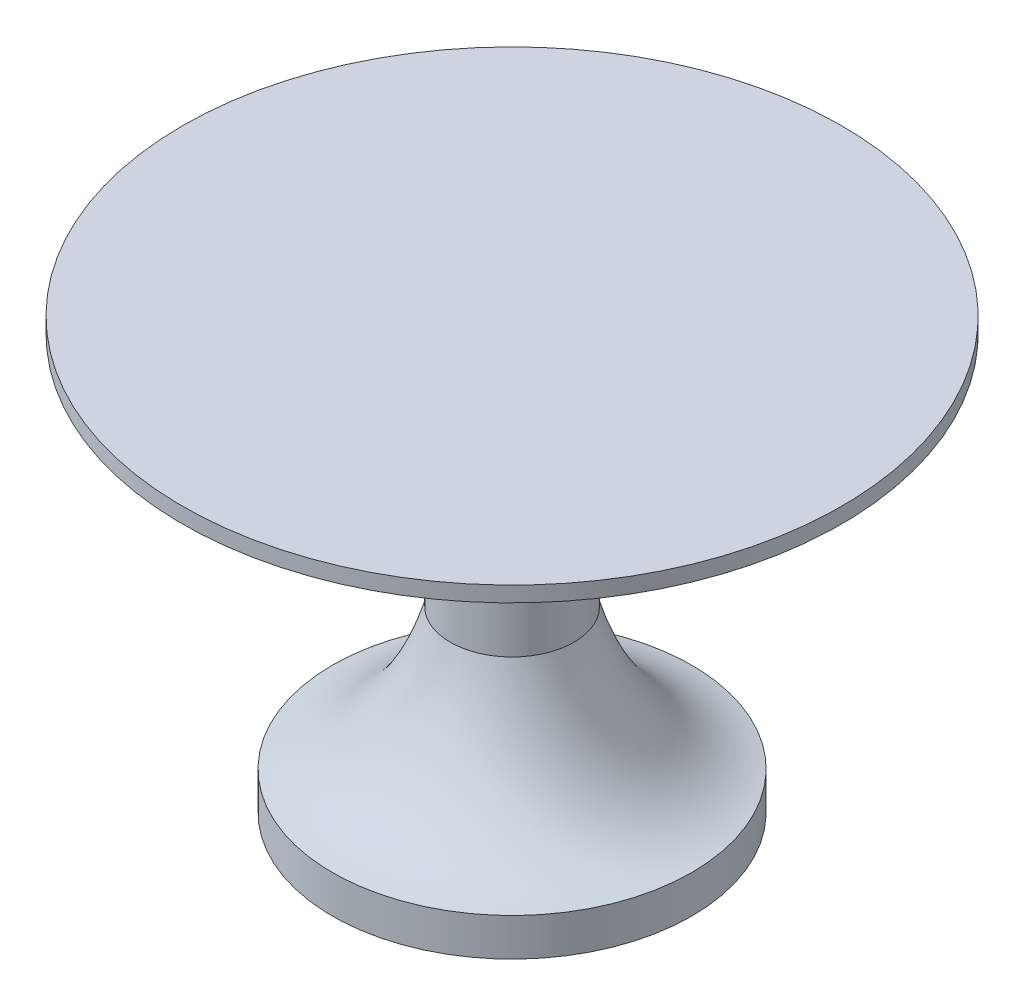
ISO-10303-21;
HEADER;
FILE_DESCRIPTION(('STEP AP214'),'2;1');
FILE_NAME('part.step','',(''),(''),'','','');
FILE_SCHEMA(('AUTOMOTIVE_DESIGN { 1 0 10303 214 1 1 1 1 }'));
ENDSEC;
DATA;
#1=APPLICATION_CONTEXT('core data for automotive mechanical design processes');
#2=APPLICATION_PROTOCOL_DEFINITION('international standard','automotive_design',2000,#1);
#3=PRODUCT_CONTEXT('',#1,'mechanical');
#4=PRODUCT('Part','Part','',(#3));
#5=PRODUCT_RELATED_PRODUCT_CATEGORY('part','',(#4));
#6=PRODUCT_DEFINITION_FORMATION('','',#4);
#7=PRODUCT_DEFINITION_CONTEXT('part definition',#1,'design');
#8=PRODUCT_DEFINITION('design','',#6,#7);
#9=PRODUCT_DEFINITION_SHAPE('','',#8);
#10=(LENGTH_UNIT() NAMED_UNIT(*) SI_UNIT(.MILLI.,.METRE.));
#11=(NAMED_UNIT(*) PLANE_ANGLE_UNIT() SI_UNIT($,.RADIAN.));
#12=(NAMED_UNIT(*) SI_UNIT($,.STERADIAN.) SOLID_ANGLE_UNIT());
#13=UNCERTAINTY_MEASURE_WITH_UNIT(LENGTH_MEASURE(1.E-05),#10,'distance_accuracy_value','');
#14=(GEOMETRIC_REPRESENTATION_CONTEXT(3) GLOBAL_UNCERTAINTY_ASSIGNED_CONTEXT((#13)) GLOBAL_UNIT_ASSIGNED_CONTEXT((#10,
#11,#12)) REPRESENTATION_CONTEXT('',''));
#15=CARTESIAN_POINT('',(0.,0.,0.));
#16=DIRECTION('',(0.,0.,1.));
#17=DIRECTION('',(1.,0.,0.));
#18=AXIS2_PLACEMENT_3D('',#15,#16,#17);
#19=CARTESIAN_POINT('',(0.,-508.,0.));
#20=DIRECTION('',(0.,1.,0.));
#21=DIRECTION('',(-1.,0.,0.));
#22=AXIS2_PLACEMENT_3D('',#19,#20,#21);
#23=PLANE('',#22);
#24=CARTESIAN_POINT('',(0.,-508.,0.));
#25=DIRECTION('',(0.,1.,0.));
#26=DIRECTION('',(-1.,0.,0.));
#27=AXIS2_PLACEMENT_3D('',#24,#25,#26);
#28=CIRCLE('',#27,57.1952071885499);
#29=CARTESIAN_POINT('',(-57.1952071885498,-508.,0.));
#30=VERTEX_POINT('',#29);
#31=EDGE_CURVE('E10',#30,#30,#28,.T.);
#32=ORIENTED_EDGE('',*,*,#31,.F.);
#33=EDGE_LOOP('',(#32));
#34=FACE_BOUND('',#33,.T.);
#35=ADVANCED_FACE('F33',(#34),#23,.F.);
#36=CARTESIAN_POINT('',(332.316500716047,-766.703289197428,0.));
#37=CARTESIAN_POINT('',(180.787832632175,-766.227742438908,0.));
#38=CARTESIAN_POINT('',(148.104498186163,-589.357090778768,0.));
#39=CARTESIAN_POINT('',(57.1952071885499,-508.,0.));
#40=B_SPLINE_CURVE_WITH_KNOTS('',3,(#36,#37,#38,#39),.UNSPECIFIED.,.F.,.F.,(4,4),(0.,1.),.UNSPECIFIED.);
#41=CARTESIAN_POINT('',(0.,0.,0.));
#42=DIRECTION('',(0.,1.,0.));
#43=AXIS1_PLACEMENT('',#41,#42);
#44=SURFACE_OF_REVOLUTION('',#40,#43);
#45=ORIENTED_EDGE('',*,*,#31,.T.);
#46=EDGE_LOOP('',(#45));
#47=FACE_BOUND('',#46,.T.);
#48=CARTESIAN_POINT('',(0.,-766.703289197428,0.));
#49=DIRECTION('',(0.,1.,0.));
#50=DIRECTION('',(-1.,0.,0.));
#51=AXIS2_PLACEMENT_3D('',#48,#49,#50);
#52=CIRCLE('',#51,332.316500716047);
#53=CARTESIAN_POINT('',(-332.316500716047,-766.703289197428,0.));
#54=VERTEX_POINT('',#53);
#55=EDGE_CURVE('E39',#54,#54,#52,.T.);
#56=ORIENTED_EDGE('',*,*,#55,.F.);
#57=EDGE_LOOP('',(#56));
#58=FACE_BOUND('',#57,.T.);
#59=ADVANCED_FACE('F81',(#47,#58),#44,.F.);
#60=CARTESIAN_POINT('',(0.,0.,0.));
#61=DIRECTION('',(0.,1.,0.));
#62=DIRECTION('',(-1.,0.,0.));
#63=AXIS2_PLACEMENT_3D('',#60,#61,#62);
#64=CYLINDRICAL_SURFACE('',#63,332.316500716047);
#65=ORIENTED_EDGE('',*,*,#55,.T.);
#66=EDGE_LOOP('',(#65));
#67=FACE_BOUND('',#66,.T.);
#68=CARTESIAN_POINT('',(0.,-696.853289197428,0.));
#69=DIRECTION('',(0.,1.,0.));
#70=DIRECTION('',(-1.,0.,0.));
#71=AXIS2_PLACEMENT_3D('',#68,#69,#70);
#72=CIRCLE('',#71,332.316500716047);
#73=CARTESIAN_POINT('',(-332.316500716047,-696.853289197428,0.));
#74=VERTEX_POINT('',#73);
#75=EDGE_CURVE('E43',#74,#74,#72,.T.);
#76=ORIENTED_EDGE('',*,*,#75,.F.);
#77=EDGE_LOOP('',(#76));
#78=FACE_BOUND('',#77,.T.);
#79=ADVANCED_FACE('F77',(#67,#78),#64,.T.);
#80=CARTESIAN_POINT('',(114.3904143771,-436.856929750547,0.));
#81=CARTESIAN_POINT('',(144.884830941808,-546.818476346836,0.));
#82=CARTESIAN_POINT('',(207.101707677945,-672.816275804568,0.));
#83=CARTESIAN_POINT('',(332.316500716047,-696.853289197428,0.));
#84=B_SPLINE_CURVE_WITH_KNOTS('',3,(#80,#81,#82,#83),.UNSPECIFIED.,.F.,.F.,(4,4),(0.,1.),.UNSPECIFIED.);
#85=CARTESIAN_POINT('',(0.,0.,0.));
#86=DIRECTION('',(0.,1.,0.));
#87=AXIS1_PLACEMENT('',#85,#86);
#88=SURFACE_OF_REVOLUTION('',#84,#87);
#89=ORIENTED_EDGE('',*,*,#75,.T.);
#90=EDGE_LOOP('',(#89));
#91=FACE_BOUND('',#90,.T.);
#92=CARTESIAN_POINT('',(0.,-436.856929750547,0.));
#93=DIRECTION('',(0.,1.,0.));
#94=DIRECTION('',(-1.,0.,0.));
#95=AXIS2_PLACEMENT_3D('',#92,#93,#94);
#96=CIRCLE('',#95,114.3904143771);
#97=CARTESIAN_POINT('',(-114.3904143771,-436.856929750547,0.));
#98=VERTEX_POINT('',#97);
#99=EDGE_CURVE('E47',#98,#98,#96,.T.);
#100=ORIENTED_EDGE('',*,*,#99,.F.);
#101=EDGE_LOOP('',(#100));
#102=FACE_BOUND('',#101,.T.);
#103=ADVANCED_FACE('F72',(#91,#102),#88,.F.);
#104=CARTESIAN_POINT('',(0.,0.,0.));
#105=DIRECTION('',(0.,1.,0.));
#106=DIRECTION('',(-1.,0.,0.));
#107=AXIS2_PLACEMENT_3D('',#104,#105,#106);
#108=CYLINDRICAL_SURFACE('',#107,114.3904143771);
#109=CARTESIAN_POINT('',(0.,0.,0.));
#110=DIRECTION('',(0.,1.,0.));
#111=DIRECTION('',(-1.,0.,0.));
#112=AXIS2_PLACEMENT_3D('',#109,#110,#111);
#113=CIRCLE('',#112,114.3904143771);
#114=CARTESIAN_POINT('',(-114.3904143771,0.,0.));
#115=VERTEX_POINT('',#114);
#116=EDGE_CURVE('E52',#115,#115,#113,.T.);
#117=ORIENTED_EDGE('',*,*,#116,.F.);
#118=EDGE_LOOP('',(#117));
#119=FACE_BOUND('',#118,.T.);
#120=ORIENTED_EDGE('',*,*,#99,.T.);
#121=EDGE_LOOP('',(#120));
#122=FACE_BOUND('',#121,.T.);
#123=ADVANCED_FACE('F76',(#119,#122),#108,.T.);
#124=CARTESIAN_POINT('',(0.,0.,0.));
#125=DIRECTION('',(0.,1.,0.));
#126=DIRECTION('',(-1.,0.,0.));
#127=AXIS2_PLACEMENT_3D('',#124,#125,#126);
#128=PLANE('',#127);
#129=CARTESIAN_POINT('',(0.,0.,0.));
#130=DIRECTION('',(0.,1.,0.));
#131=DIRECTION('',(-1.,0.,0.));
#132=AXIS2_PLACEMENT_3D('',#129,#130,#131);
#133=CIRCLE('',#132,609.6);
#134=CARTESIAN_POINT('',(-609.6,-1.49308937752045E-13,0.));
#135=VERTEX_POINT('',#134);
#136=EDGE_CURVE('E55',#135,#135,#133,.T.);
#137=ORIENTED_EDGE('',*,*,#136,.F.);
#138=EDGE_LOOP('',(#137));
#139=FACE_BOUND('',#138,.T.);
#140=ORIENTED_EDGE('',*,*,#116,.T.);
#141=EDGE_LOOP('',(#140));
#142=FACE_BOUND('',#141,.T.);
#143=ADVANCED_FACE('F115',(#139,#142),#128,.F.);
#144=CARTESIAN_POINT('',(0.,0.,0.));
#145=DIRECTION('',(0.,1.,0.));
#146=DIRECTION('',(-1.,0.,0.));
#147=AXIS2_PLACEMENT_3D('',#144,#145,#146);
#148=CYLINDRICAL_SURFACE('',#147,609.6);
#149=ORIENTED_EDGE('',*,*,#136,.T.);
#150=EDGE_LOOP('',(#149));
#151=FACE_BOUND('',#150,.T.);
#152=CARTESIAN_POINT('',(0.,28.5749999999999,0.));
#153=DIRECTION('',(0.,1.,0.));
#154=DIRECTION('',(-1.,0.,0.));
#155=AXIS2_PLACEMENT_3D('',#152,#153,#154);
#156=CIRCLE('',#155,609.6);
#157=CARTESIAN_POINT('',(-609.6,28.5749999999998,0.));
#158=VERTEX_POINT('',#157);
#159=EDGE_CURVE('E58',#158,#158,#156,.T.);
#160=ORIENTED_EDGE('',*,*,#159,.F.);
#161=EDGE_LOOP('',(#160));
#162=FACE_BOUND('',#161,.T.);
#163=ADVANCED_FACE('F124',(#151,#162),#148,.T.);
#164=CARTESIAN_POINT('',(0.,28.575,0.));
#165=DIRECTION('',(0.,1.,0.));
#166=DIRECTION('',(-1.,0.,0.));
#167=AXIS2_PLACEMENT_3D('',#164,#165,#166);
#168=PLANE('',#167);
#169=ORIENTED_EDGE('',*,*,#159,.T.);
#170=EDGE_LOOP('',(#169));
#171=FACE_BOUND('',#170,.T.);
#172=ADVANCED_FACE('F133',(#171),#168,.T.);
#173=CLOSED_SHELL('',(#35,#59,#79,#103,#123,#143,#163,#172));
#174=MANIFOLD_SOLID_BREP('B2',#173);
#175=ADVANCED_BREP_SHAPE_REPRESENTATION('',(#18,#174),#14);
#176=SHAPE_DEFINITION_REPRESENTATION(#9,#175);
ENDSEC;
END-ISO-10303-21;
